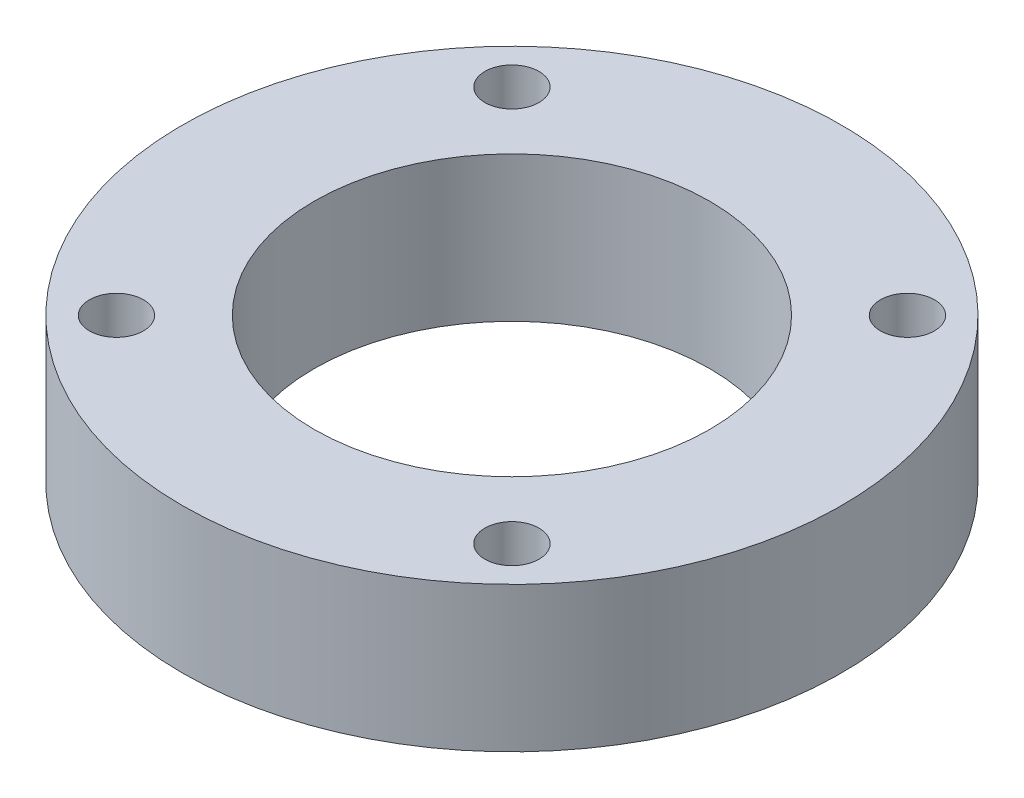
ISO-10303-21;
HEADER;
FILE_DESCRIPTION(('STEP AP214'),'2;1');
FILE_NAME('part.step','',(''),(''),'','','');
FILE_SCHEMA(('AUTOMOTIVE_DESIGN { 1 0 10303 214 1 1 1 1 }'));
ENDSEC;
DATA;
#1=APPLICATION_CONTEXT('core data for automotive mechanical design processes');
#2=APPLICATION_PROTOCOL_DEFINITION('international standard','automotive_design',2000,#1);
#3=PRODUCT_CONTEXT('',#1,'mechanical');
#4=PRODUCT('Part','Part','',(#3));
#5=PRODUCT_RELATED_PRODUCT_CATEGORY('part','',(#4));
#6=PRODUCT_DEFINITION_FORMATION('','',#4);
#7=PRODUCT_DEFINITION_CONTEXT('part definition',#1,'design');
#8=PRODUCT_DEFINITION('design','',#6,#7);
#9=PRODUCT_DEFINITION_SHAPE('','',#8);
#10=(LENGTH_UNIT() NAMED_UNIT(*) SI_UNIT(.MILLI.,.METRE.));
#11=(NAMED_UNIT(*) PLANE_ANGLE_UNIT() SI_UNIT($,.RADIAN.));
#12=(NAMED_UNIT(*) SI_UNIT($,.STERADIAN.) SOLID_ANGLE_UNIT());
#13=UNCERTAINTY_MEASURE_WITH_UNIT(LENGTH_MEASURE(1.E-05),#10,'distance_accuracy_value','');
#14=(GEOMETRIC_REPRESENTATION_CONTEXT(3) GLOBAL_UNCERTAINTY_ASSIGNED_CONTEXT((#13)) GLOBAL_UNIT_ASSIGNED_CONTEXT((#10,
#11,#12)) REPRESENTATION_CONTEXT('',''));
#15=CARTESIAN_POINT('',(0.,0.,0.));
#16=DIRECTION('',(0.,0.,1.));
#17=DIRECTION('',(1.,0.,0.));
#18=AXIS2_PLACEMENT_3D('',#15,#16,#17);
#19=CARTESIAN_POINT('',(0.,11.,0.));
#20=DIRECTION('',(0.,1.,0.));
#21=DIRECTION('',(0.,0.,1.));
#22=AXIS2_PLACEMENT_3D('',#19,#20,#21);
#23=PLANE('',#22);
#24=CARTESIAN_POINT('',(0.,11.,0.));
#25=DIRECTION('',(0.,1.,0.));
#26=DIRECTION('',(0.,0.,1.));
#27=AXIS2_PLACEMENT_3D('',#24,#25,#26);
#28=CIRCLE('',#27,15.);
#29=CARTESIAN_POINT('',(0.,11.,15.));
#30=VERTEX_POINT('',#29);
#31=EDGE_CURVE('E71',#30,#30,#28,.T.);
#32=ORIENTED_EDGE('',*,*,#31,.F.);
#33=EDGE_LOOP('',(#32));
#34=FACE_BOUND('',#33,.T.);
#35=CARTESIAN_POINT('',(15.,11.,15.));
#36=DIRECTION('',(0.,1.,0.));
#37=DIRECTION('',(0.,0.,1.));
#38=AXIS2_PLACEMENT_3D('',#35,#36,#37);
#39=CIRCLE('',#38,2.05);
#40=CARTESIAN_POINT('',(15.,11.,17.05));
#41=VERTEX_POINT('',#40);
#42=EDGE_CURVE('E56',#41,#41,#39,.T.);
#43=ORIENTED_EDGE('',*,*,#42,.F.);
#44=EDGE_LOOP('',(#43));
#45=FACE_BOUND('',#44,.T.);
#46=CARTESIAN_POINT('',(-15.,11.,-15.));
#47=DIRECTION('',(0.,1.,0.));
#48=DIRECTION('',(0.,0.,1.));
#49=AXIS2_PLACEMENT_3D('',#46,#47,#48);
#50=CIRCLE('',#49,2.05);
#51=CARTESIAN_POINT('',(-15.,11.,-12.95));
#52=VERTEX_POINT('',#51);
#53=EDGE_CURVE('E45',#52,#52,#50,.T.);
#54=ORIENTED_EDGE('',*,*,#53,.F.);
#55=EDGE_LOOP('',(#54));
#56=FACE_BOUND('',#55,.T.);
#57=CARTESIAN_POINT('',(0.,11.,0.));
#58=DIRECTION('',(0.,1.,0.));
#59=DIRECTION('',(0.,0.,1.));
#60=AXIS2_PLACEMENT_3D('',#57,#58,#59);
#61=CIRCLE('',#60,25.);
#62=CARTESIAN_POINT('',(0.,11.,25.));
#63=VERTEX_POINT('',#62);
#64=EDGE_CURVE('E10',#63,#63,#61,.T.);
#65=ORIENTED_EDGE('',*,*,#64,.T.);
#66=EDGE_LOOP('',(#65));
#67=FACE_BOUND('',#66,.T.);
#68=CARTESIAN_POINT('',(15.,11.,-15.));
#69=DIRECTION('',(0.,1.,0.));
#70=DIRECTION('',(0.,0.,1.));
#71=AXIS2_PLACEMENT_3D('',#68,#69,#70);
#72=CIRCLE('',#71,2.05);
#73=CARTESIAN_POINT('',(15.,11.,-12.95));
#74=VERTEX_POINT('',#73);
#75=EDGE_CURVE('E50',#74,#74,#72,.T.);
#76=ORIENTED_EDGE('',*,*,#75,.F.);
#77=EDGE_LOOP('',(#76));
#78=FACE_BOUND('',#77,.T.);
#79=CARTESIAN_POINT('',(-15.,11.,15.));
#80=DIRECTION('',(0.,1.,0.));
#81=DIRECTION('',(0.,0.,1.));
#82=AXIS2_PLACEMENT_3D('',#79,#80,#81);
#83=CIRCLE('',#82,2.05);
#84=CARTESIAN_POINT('',(-15.,11.,17.05));
#85=VERTEX_POINT('',#84);
#86=EDGE_CURVE('E62',#85,#85,#83,.T.);
#87=ORIENTED_EDGE('',*,*,#86,.F.);
#88=EDGE_LOOP('',(#87));
#89=FACE_BOUND('',#88,.T.);
#90=ADVANCED_FACE('F34',(#34,#45,#56,#67,#78,#89),#23,.T.);
#91=CARTESIAN_POINT('',(0.,0.,0.));
#92=DIRECTION('',(0.,1.,0.));
#93=DIRECTION('',(0.,0.,1.));
#94=AXIS2_PLACEMENT_3D('',#91,#92,#93);
#95=PLANE('',#94);
#96=CARTESIAN_POINT('',(0.,0.,0.));
#97=DIRECTION('',(0.,1.,0.));
#98=DIRECTION('',(0.,0.,1.));
#99=AXIS2_PLACEMENT_3D('',#96,#97,#98);
#100=CIRCLE('',#99,15.);
#101=CARTESIAN_POINT('',(0.,0.,15.));
#102=VERTEX_POINT('',#101);
#103=EDGE_CURVE('E68',#102,#102,#100,.T.);
#104=ORIENTED_EDGE('',*,*,#103,.T.);
#105=EDGE_LOOP('',(#104));
#106=FACE_BOUND('',#105,.T.);
#107=CARTESIAN_POINT('',(0.,0.,0.));
#108=DIRECTION('',(0.,1.,0.));
#109=DIRECTION('',(0.,0.,1.));
#110=AXIS2_PLACEMENT_3D('',#107,#108,#109);
#111=CIRCLE('',#110,25.);
#112=CARTESIAN_POINT('',(0.,0.,25.));
#113=VERTEX_POINT('',#112);
#114=EDGE_CURVE('E38',#113,#113,#111,.T.);
#115=ORIENTED_EDGE('',*,*,#114,.F.);
#116=EDGE_LOOP('',(#115));
#117=FACE_BOUND('',#116,.T.);
#118=CARTESIAN_POINT('',(-15.,0.,-15.));
#119=DIRECTION('',(0.,1.,0.));
#120=DIRECTION('',(0.,0.,1.));
#121=AXIS2_PLACEMENT_3D('',#118,#119,#120);
#122=CIRCLE('',#121,2.05);
#123=CARTESIAN_POINT('',(-15.,0.,-12.95));
#124=VERTEX_POINT('',#123);
#125=EDGE_CURVE('E47',#124,#124,#122,.T.);
#126=ORIENTED_EDGE('',*,*,#125,.T.);
#127=EDGE_LOOP('',(#126));
#128=FACE_BOUND('',#127,.T.);
#129=CARTESIAN_POINT('',(15.,0.,-15.));
#130=DIRECTION('',(0.,1.,0.));
#131=DIRECTION('',(0.,0.,1.));
#132=AXIS2_PLACEMENT_3D('',#129,#130,#131);
#133=CIRCLE('',#132,2.05);
#134=CARTESIAN_POINT('',(15.,0.,-12.95));
#135=VERTEX_POINT('',#134);
#136=EDGE_CURVE('E53',#135,#135,#133,.T.);
#137=ORIENTED_EDGE('',*,*,#136,.T.);
#138=EDGE_LOOP('',(#137));
#139=FACE_BOUND('',#138,.T.);
#140=CARTESIAN_POINT('',(15.,0.,15.));
#141=DIRECTION('',(0.,1.,0.));
#142=DIRECTION('',(0.,0.,1.));
#143=AXIS2_PLACEMENT_3D('',#140,#141,#142);
#144=CIRCLE('',#143,2.05);
#145=CARTESIAN_POINT('',(15.,0.,17.05));
#146=VERTEX_POINT('',#145);
#147=EDGE_CURVE('E59',#146,#146,#144,.T.);
#148=ORIENTED_EDGE('',*,*,#147,.T.);
#149=EDGE_LOOP('',(#148));
#150=FACE_BOUND('',#149,.T.);
#151=CARTESIAN_POINT('',(-15.,0.,15.));
#152=DIRECTION('',(0.,1.,0.));
#153=DIRECTION('',(0.,0.,1.));
#154=AXIS2_PLACEMENT_3D('',#151,#152,#153);
#155=CIRCLE('',#154,2.05);
#156=CARTESIAN_POINT('',(-15.,0.,17.05));
#157=VERTEX_POINT('',#156);
#158=EDGE_CURVE('E65',#157,#157,#155,.T.);
#159=ORIENTED_EDGE('',*,*,#158,.T.);
#160=EDGE_LOOP('',(#159));
#161=FACE_BOUND('',#160,.T.);
#162=ADVANCED_FACE('F77',(#106,#117,#128,#139,#150,#161),#95,.F.);
#163=CARTESIAN_POINT('',(0.,11.,0.));
#164=DIRECTION('',(0.,-1.,0.));
#165=DIRECTION('',(0.,0.,-1.));
#166=AXIS2_PLACEMENT_3D('',#163,#164,#165);
#167=CYLINDRICAL_SURFACE('',#166,25.);
#168=ORIENTED_EDGE('',*,*,#64,.F.);
#169=EDGE_LOOP('',(#168));
#170=FACE_BOUND('',#169,.T.);
#171=ORIENTED_EDGE('',*,*,#114,.T.);
#172=EDGE_LOOP('',(#171));
#173=FACE_BOUND('',#172,.T.);
#174=ADVANCED_FACE('F36',(#170,#173),#167,.T.);
#175=CARTESIAN_POINT('',(-15.,11.,-15.));
#176=DIRECTION('',(0.,-1.,0.));
#177=DIRECTION('',(0.,0.,-1.));
#178=AXIS2_PLACEMENT_3D('',#175,#176,#177);
#179=CYLINDRICAL_SURFACE('',#178,2.05);
#180=ORIENTED_EDGE('',*,*,#53,.T.);
#181=EDGE_LOOP('',(#180));
#182=FACE_BOUND('',#181,.T.);
#183=ORIENTED_EDGE('',*,*,#125,.F.);
#184=EDGE_LOOP('',(#183));
#185=FACE_BOUND('',#184,.T.);
#186=ADVANCED_FACE('F108',(#182,#185),#179,.F.);
#187=CARTESIAN_POINT('',(15.,11.,-15.));
#188=DIRECTION('',(0.,-1.,0.));
#189=DIRECTION('',(0.,0.,-1.));
#190=AXIS2_PLACEMENT_3D('',#187,#188,#189);
#191=CYLINDRICAL_SURFACE('',#190,2.05);
#192=ORIENTED_EDGE('',*,*,#75,.T.);
#193=EDGE_LOOP('',(#192));
#194=FACE_BOUND('',#193,.T.);
#195=ORIENTED_EDGE('',*,*,#136,.F.);
#196=EDGE_LOOP('',(#195));
#197=FACE_BOUND('',#196,.T.);
#198=ADVANCED_FACE('F113',(#194,#197),#191,.F.);
#199=CARTESIAN_POINT('',(15.,11.,15.));
#200=DIRECTION('',(0.,-1.,0.));
#201=DIRECTION('',(0.,0.,-1.));
#202=AXIS2_PLACEMENT_3D('',#199,#200,#201);
#203=CYLINDRICAL_SURFACE('',#202,2.05);
#204=ORIENTED_EDGE('',*,*,#42,.T.);
#205=EDGE_LOOP('',(#204));
#206=FACE_BOUND('',#205,.T.);
#207=ORIENTED_EDGE('',*,*,#147,.F.);
#208=EDGE_LOOP('',(#207));
#209=FACE_BOUND('',#208,.T.);
#210=ADVANCED_FACE('F100',(#206,#209),#203,.F.);
#211=CARTESIAN_POINT('',(-15.,11.,15.));
#212=DIRECTION('',(0.,-1.,0.));
#213=DIRECTION('',(0.,0.,-1.));
#214=AXIS2_PLACEMENT_3D('',#211,#212,#213);
#215=CYLINDRICAL_SURFACE('',#214,2.05);
#216=ORIENTED_EDGE('',*,*,#86,.T.);
#217=EDGE_LOOP('',(#216));
#218=FACE_BOUND('',#217,.T.);
#219=ORIENTED_EDGE('',*,*,#158,.F.);
#220=EDGE_LOOP('',(#219));
#221=FACE_BOUND('',#220,.T.);
#222=ADVANCED_FACE('F83',(#218,#221),#215,.F.);
#223=CARTESIAN_POINT('',(0.,0.,0.));
#224=DIRECTION('',(0.,1.,0.));
#225=DIRECTION('',(0.,0.,1.));
#226=AXIS2_PLACEMENT_3D('',#223,#224,#225);
#227=CYLINDRICAL_SURFACE('',#226,15.);
#228=ORIENTED_EDGE('',*,*,#103,.F.);
#229=EDGE_LOOP('',(#228));
#230=FACE_BOUND('',#229,.T.);
#231=ORIENTED_EDGE('',*,*,#31,.T.);
#232=EDGE_LOOP('',(#231));
#233=FACE_BOUND('',#232,.T.);
#234=ADVANCED_FACE('F80',(#230,#233),#227,.F.);
#235=CLOSED_SHELL('',(#90,#162,#174,#186,#198,#210,#222,#234));
#236=MANIFOLD_SOLID_BREP('B2',#235);
#237=ADVANCED_BREP_SHAPE_REPRESENTATION('',(#18,#236),#14);
#238=SHAPE_DEFINITION_REPRESENTATION(#9,#237);
ENDSEC;
END-ISO-10303-21;
